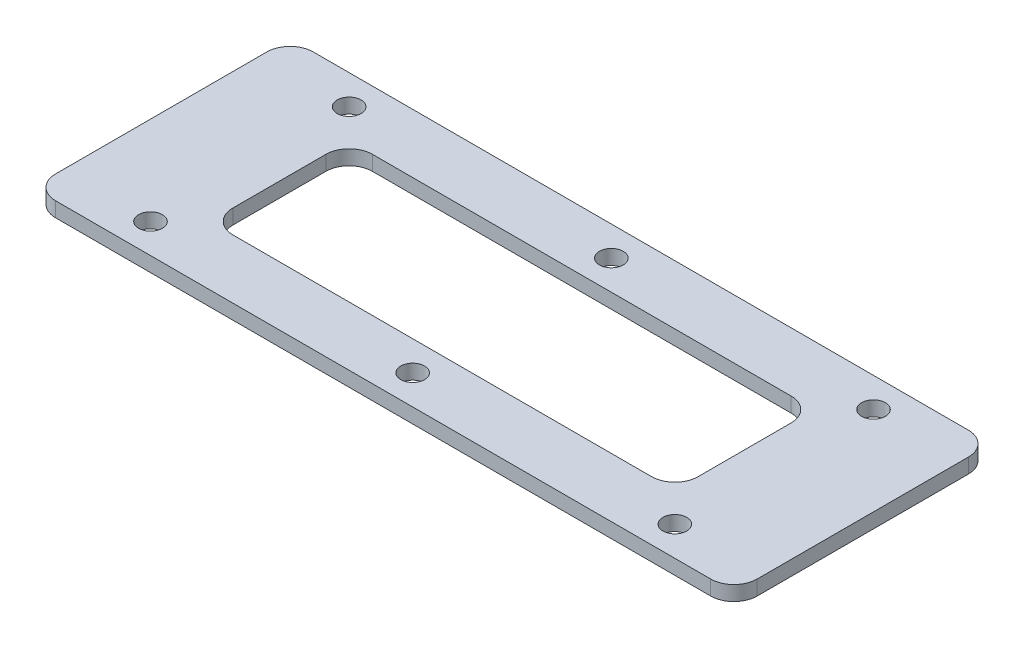
ISO-10303-21;
HEADER;
FILE_DESCRIPTION(('STEP AP214'),'2;1');
FILE_NAME('part.step','',(''),(''),'','','');
FILE_SCHEMA(('AUTOMOTIVE_DESIGN { 1 0 10303 214 1 1 1 1 }'));
ENDSEC;
DATA;
#1=APPLICATION_CONTEXT('core data for automotive mechanical design processes');
#2=APPLICATION_PROTOCOL_DEFINITION('international standard','automotive_design',2000,#1);
#3=PRODUCT_CONTEXT('',#1,'mechanical');
#4=PRODUCT('Part','Part','',(#3));
#5=PRODUCT_RELATED_PRODUCT_CATEGORY('part','',(#4));
#6=PRODUCT_DEFINITION_FORMATION('','',#4);
#7=PRODUCT_DEFINITION_CONTEXT('part definition',#1,'design');
#8=PRODUCT_DEFINITION('design','',#6,#7);
#9=PRODUCT_DEFINITION_SHAPE('','',#8);
#10=(LENGTH_UNIT() NAMED_UNIT(*) SI_UNIT(.MILLI.,.METRE.));
#11=(NAMED_UNIT(*) PLANE_ANGLE_UNIT() SI_UNIT($,.RADIAN.));
#12=(NAMED_UNIT(*) SI_UNIT($,.STERADIAN.) SOLID_ANGLE_UNIT());
#13=UNCERTAINTY_MEASURE_WITH_UNIT(LENGTH_MEASURE(1.E-05),#10,'distance_accuracy_value','');
#14=(GEOMETRIC_REPRESENTATION_CONTEXT(3) GLOBAL_UNCERTAINTY_ASSIGNED_CONTEXT((#13)) GLOBAL_UNIT_ASSIGNED_CONTEXT((#10,
#11,#12)) REPRESENTATION_CONTEXT('',''));
#15=CARTESIAN_POINT('',(0.,0.,0.));
#16=DIRECTION('',(0.,0.,1.));
#17=DIRECTION('',(1.,0.,0.));
#18=AXIS2_PLACEMENT_3D('',#15,#16,#17);
#19=CARTESIAN_POINT('',(-70.4,3.175,-22.7));
#20=DIRECTION('',(0.,1.,0.));
#21=DIRECTION('',(0.,0.,1.));
#22=AXIS2_PLACEMENT_3D('',#19,#20,#21);
#23=PLANE('',#22);
#24=CARTESIAN_POINT('',(0.,3.175,-21.35));
#25=DIRECTION('',(0.,1.,0.));
#26=DIRECTION('',(0.,0.,1.));
#27=AXIS2_PLACEMENT_3D('',#24,#25,#26);
#28=CIRCLE('',#27,2.55269999999999);
#29=CARTESIAN_POINT('',(0.,3.175,-18.7973));
#30=VERTEX_POINT('',#29);
#31=EDGE_CURVE('E404',#30,#30,#28,.T.);
#32=ORIENTED_EDGE('',*,*,#31,.F.);
#33=EDGE_LOOP('',(#32));
#34=FACE_BOUND('',#33,.T.);
#35=CARTESIAN_POINT('',(56.35,3.175,21.35));
#36=DIRECTION('',(0.,1.,0.));
#37=DIRECTION('',(0.,0.,1.));
#38=AXIS2_PLACEMENT_3D('',#35,#36,#37);
#39=CIRCLE('',#38,2.5527);
#40=CARTESIAN_POINT('',(56.35,3.175,23.9027));
#41=VERTEX_POINT('',#40);
#42=EDGE_CURVE('E416',#41,#41,#39,.T.);
#43=ORIENTED_EDGE('',*,*,#42,.F.);
#44=EDGE_LOOP('',(#43));
#45=FACE_BOUND('',#44,.T.);
#46=CARTESIAN_POINT('',(-56.35,3.175,21.35));
#47=DIRECTION('',(0.,1.,0.));
#48=DIRECTION('',(0.,0.,1.));
#49=AXIS2_PLACEMENT_3D('',#46,#47,#48);
#50=CIRCLE('',#49,2.5527);
#51=CARTESIAN_POINT('',(-56.35,3.175,23.9027));
#52=VERTEX_POINT('',#51);
#53=EDGE_CURVE('E192',#52,#52,#50,.T.);
#54=ORIENTED_EDGE('',*,*,#53,.F.);
#55=EDGE_LOOP('',(#54));
#56=FACE_BOUND('',#55,.T.);
#57=CARTESIAN_POINT('',(-70.4,3.175,-22.7));
#58=DIRECTION('',(0.,1.,0.));
#59=DIRECTION('',(0.,0.,1.));
#60=AXIS2_PLACEMENT_3D('',#57,#58,#59);
#61=CIRCLE('',#60,5.);
#62=CARTESIAN_POINT('',(-70.4,3.175,-27.7));
#63=VERTEX_POINT('',#62);
#64=CARTESIAN_POINT('',(-75.4,3.175,-22.7));
#65=VERTEX_POINT('',#64);
#66=EDGE_CURVE('E222',#63,#65,#61,.T.);
#67=ORIENTED_EDGE('',*,*,#66,.T.);
#68=DIRECTION('',(0.,0.,1.));
#69=VECTOR('',#68,1.);
#70=CARTESIAN_POINT('',(-75.4,3.175,-22.7));
#71=LINE('',#70,#69);
#72=CARTESIAN_POINT('',(-75.4,3.175,22.7));
#73=VERTEX_POINT('',#72);
#74=EDGE_CURVE('E225',#65,#73,#71,.T.);
#75=ORIENTED_EDGE('',*,*,#74,.T.);
#76=CARTESIAN_POINT('',(-70.4,3.175,22.7));
#77=DIRECTION('',(0.,1.,0.));
#78=DIRECTION('',(0.,0.,1.));
#79=AXIS2_PLACEMENT_3D('',#76,#77,#78);
#80=CIRCLE('',#79,5.);
#81=CARTESIAN_POINT('',(-70.4,3.175,27.7));
#82=VERTEX_POINT('',#81);
#83=EDGE_CURVE('E228',#73,#82,#80,.T.);
#84=ORIENTED_EDGE('',*,*,#83,.T.);
#85=DIRECTION('',(1.,0.,0.));
#86=VECTOR('',#85,1.);
#87=CARTESIAN_POINT('',(-70.4,3.175,27.7));
#88=LINE('',#87,#86);
#89=CARTESIAN_POINT('',(70.4,3.175,27.7));
#90=VERTEX_POINT('',#89);
#91=EDGE_CURVE('E230',#82,#90,#88,.T.);
#92=ORIENTED_EDGE('',*,*,#91,.T.);
#93=CARTESIAN_POINT('',(70.4,3.175,22.7));
#94=DIRECTION('',(0.,1.,0.));
#95=DIRECTION('',(0.,0.,1.));
#96=AXIS2_PLACEMENT_3D('',#93,#94,#95);
#97=CIRCLE('',#96,5.);
#98=CARTESIAN_POINT('',(75.4,3.175,22.7));
#99=VERTEX_POINT('',#98);
#100=EDGE_CURVE('E232',#90,#99,#97,.T.);
#101=ORIENTED_EDGE('',*,*,#100,.T.);
#102=DIRECTION('',(0.,0.,-1.));
#103=VECTOR('',#102,1.);
#104=CARTESIAN_POINT('',(75.4,3.175,22.7));
#105=LINE('',#104,#103);
#106=CARTESIAN_POINT('',(75.4,3.175,-22.7));
#107=VERTEX_POINT('',#106);
#108=EDGE_CURVE('E234',#99,#107,#105,.T.);
#109=ORIENTED_EDGE('',*,*,#108,.T.);
#110=CARTESIAN_POINT('',(70.4,3.175,-22.7));
#111=DIRECTION('',(0.,1.,0.));
#112=DIRECTION('',(0.,0.,1.));
#113=AXIS2_PLACEMENT_3D('',#110,#111,#112);
#114=CIRCLE('',#113,5.);
#115=CARTESIAN_POINT('',(70.4,3.175,-27.7));
#116=VERTEX_POINT('',#115);
#117=EDGE_CURVE('E236',#107,#116,#114,.T.);
#118=ORIENTED_EDGE('',*,*,#117,.T.);
#119=DIRECTION('',(-1.,0.,0.));
#120=VECTOR('',#119,1.);
#121=CARTESIAN_POINT('',(70.4,3.175,-27.7));
#122=LINE('',#121,#120);
#123=EDGE_CURVE('E238',#116,#63,#122,.T.);
#124=ORIENTED_EDGE('',*,*,#123,.T.);
#125=EDGE_LOOP('',(#67,#75,#84,#92,#101,#109,#118,#124));
#126=FACE_BOUND('',#125,.T.);
#127=DIRECTION('',(0.,0.,1.));
#128=VECTOR('',#127,1.);
#129=CARTESIAN_POINT('',(-50.,3.175,-10.));
#130=LINE('',#129,#128);
#131=CARTESIAN_POINT('',(-50.,3.175,-10.));
#132=VERTEX_POINT('',#131);
#133=CARTESIAN_POINT('',(-50.,3.175,10.));
#134=VERTEX_POINT('',#133);
#135=EDGE_CURVE('E162',#132,#134,#130,.T.);
#136=ORIENTED_EDGE('',*,*,#135,.F.);
#137=CARTESIAN_POINT('',(-45.,3.175,-10.));
#138=DIRECTION('',(0.,1.,0.));
#139=DIRECTION('',(0.,0.,1.));
#140=AXIS2_PLACEMENT_3D('',#137,#138,#139);
#141=CIRCLE('',#140,5.);
#142=CARTESIAN_POINT('',(-45.,3.175,-15.));
#143=VERTEX_POINT('',#142);
#144=EDGE_CURVE('E154',#143,#132,#141,.T.);
#145=ORIENTED_EDGE('',*,*,#144,.F.);
#146=DIRECTION('',(-1.,0.,0.));
#147=VECTOR('',#146,1.);
#148=CARTESIAN_POINT('',(45.,3.175,-15.));
#149=LINE('',#148,#147);
#150=CARTESIAN_POINT('',(45.,3.175,-15.));
#151=VERTEX_POINT('',#150);
#152=EDGE_CURVE('E189',#151,#143,#149,.T.);
#153=ORIENTED_EDGE('',*,*,#152,.F.);
#154=CARTESIAN_POINT('',(45.,3.175,-10.));
#155=DIRECTION('',(0.,1.,0.));
#156=DIRECTION('',(0.,0.,1.));
#157=AXIS2_PLACEMENT_3D('',#154,#155,#156);
#158=CIRCLE('',#157,5.);
#159=CARTESIAN_POINT('',(50.,3.175,-10.));
#160=VERTEX_POINT('',#159);
#161=EDGE_CURVE('E187',#160,#151,#158,.T.);
#162=ORIENTED_EDGE('',*,*,#161,.F.);
#163=DIRECTION('',(0.,0.,-1.));
#164=VECTOR('',#163,1.);
#165=CARTESIAN_POINT('',(50.,3.175,9.99999999999999));
#166=LINE('',#165,#164);
#167=CARTESIAN_POINT('',(50.,3.175,9.99999999999999));
#168=VERTEX_POINT('',#167);
#169=EDGE_CURVE('E185',#168,#160,#166,.T.);
#170=ORIENTED_EDGE('',*,*,#169,.F.);
#171=CARTESIAN_POINT('',(45.,3.175,10.));
#172=DIRECTION('',(0.,1.,0.));
#173=DIRECTION('',(0.,0.,1.));
#174=AXIS2_PLACEMENT_3D('',#171,#172,#173);
#175=CIRCLE('',#174,5.);
#176=CARTESIAN_POINT('',(45.,3.175,15.));
#177=VERTEX_POINT('',#176);
#178=EDGE_CURVE('E183',#177,#168,#175,.T.);
#179=ORIENTED_EDGE('',*,*,#178,.F.);
#180=DIRECTION('',(1.,0.,0.));
#181=VECTOR('',#180,1.);
#182=CARTESIAN_POINT('',(-45.,3.175,15.));
#183=LINE('',#182,#181);
#184=CARTESIAN_POINT('',(-45.,3.175,15.));
#185=VERTEX_POINT('',#184);
#186=EDGE_CURVE('E178',#185,#177,#183,.T.);
#187=ORIENTED_EDGE('',*,*,#186,.F.);
#188=CARTESIAN_POINT('',(-45.,3.175,10.));
#189=DIRECTION('',(0.,1.,0.));
#190=DIRECTION('',(0.,0.,1.));
#191=AXIS2_PLACEMENT_3D('',#188,#189,#190);
#192=CIRCLE('',#191,5.);
#193=EDGE_CURVE('E176',#134,#185,#192,.T.);
#194=ORIENTED_EDGE('',*,*,#193,.F.);
#195=EDGE_LOOP('',(#136,#145,#153,#162,#170,#179,#187,#194));
#196=FACE_BOUND('',#195,.T.);
#197=CARTESIAN_POINT('',(0.,3.175,21.35));
#198=DIRECTION('',(0.,1.,0.));
#199=DIRECTION('',(0.,0.,1.));
#200=AXIS2_PLACEMENT_3D('',#197,#198,#199);
#201=CIRCLE('',#200,2.55269999999999);
#202=CARTESIAN_POINT('',(0.,3.175,23.9027));
#203=VERTEX_POINT('',#202);
#204=EDGE_CURVE('E422',#203,#203,#201,.T.);
#205=ORIENTED_EDGE('',*,*,#204,.F.);
#206=EDGE_LOOP('',(#205));
#207=FACE_BOUND('',#206,.T.);
#208=CARTESIAN_POINT('',(56.35,3.175,-21.35));
#209=DIRECTION('',(0.,1.,0.));
#210=DIRECTION('',(0.,0.,1.));
#211=AXIS2_PLACEMENT_3D('',#208,#209,#210);
#212=CIRCLE('',#211,2.5527);
#213=CARTESIAN_POINT('',(56.35,3.175,-18.7973));
#214=VERTEX_POINT('',#213);
#215=EDGE_CURVE('E410',#214,#214,#212,.T.);
#216=ORIENTED_EDGE('',*,*,#215,.F.);
#217=EDGE_LOOP('',(#216));
#218=FACE_BOUND('',#217,.T.);
#219=CARTESIAN_POINT('',(-56.35,3.175,-21.35));
#220=DIRECTION('',(0.,1.,0.));
#221=DIRECTION('',(0.,0.,1.));
#222=AXIS2_PLACEMENT_3D('',#219,#220,#221);
#223=CIRCLE('',#222,2.5527);
#224=CARTESIAN_POINT('',(-56.35,3.175,-18.7973));
#225=VERTEX_POINT('',#224);
#226=EDGE_CURVE('E395',#225,#225,#223,.T.);
#227=ORIENTED_EDGE('',*,*,#226,.F.);
#228=EDGE_LOOP('',(#227));
#229=FACE_BOUND('',#228,.T.);
#230=ADVANCED_FACE('F41',(#34,#45,#56,#126,#196,#207,#218,#229),#23,.T.);
#231=CARTESIAN_POINT('',(-70.4,0.,-22.7));
#232=DIRECTION('',(0.,1.,0.));
#233=DIRECTION('',(0.,0.,1.));
#234=AXIS2_PLACEMENT_3D('',#231,#232,#233);
#235=PLANE('',#234);
#236=CARTESIAN_POINT('',(-70.4,0.,-22.7));
#237=DIRECTION('',(0.,1.,0.));
#238=DIRECTION('',(0.,0.,1.));
#239=AXIS2_PLACEMENT_3D('',#236,#237,#238);
#240=CIRCLE('',#239,5.);
#241=CARTESIAN_POINT('',(-70.4,0.,-27.7));
#242=VERTEX_POINT('',#241);
#243=CARTESIAN_POINT('',(-75.4,0.,-22.7));
#244=VERTEX_POINT('',#243);
#245=EDGE_CURVE('E170',#242,#244,#240,.T.);
#246=ORIENTED_EDGE('',*,*,#245,.F.);
#247=DIRECTION('',(-1.,0.,0.));
#248=VECTOR('',#247,1.);
#249=CARTESIAN_POINT('',(70.4,0.,-27.7));
#250=LINE('',#249,#248);
#251=CARTESIAN_POINT('',(70.4,0.,-27.7));
#252=VERTEX_POINT('',#251);
#253=EDGE_CURVE('E226',#252,#242,#250,.T.);
#254=ORIENTED_EDGE('',*,*,#253,.F.);
#255=CARTESIAN_POINT('',(70.4,0.,-22.7));
#256=DIRECTION('',(0.,1.,0.));
#257=DIRECTION('',(0.,0.,1.));
#258=AXIS2_PLACEMENT_3D('',#255,#256,#257);
#259=CIRCLE('',#258,5.);
#260=CARTESIAN_POINT('',(75.4,0.,-22.7));
#261=VERTEX_POINT('',#260);
#262=EDGE_CURVE('E254',#261,#252,#259,.T.);
#263=ORIENTED_EDGE('',*,*,#262,.F.);
#264=DIRECTION('',(0.,0.,-1.));
#265=VECTOR('',#264,1.);
#266=CARTESIAN_POINT('',(75.4,0.,0.));
#267=LINE('',#266,#265);
#268=CARTESIAN_POINT('',(75.4,0.,22.7));
#269=VERTEX_POINT('',#268);
#270=EDGE_CURVE('E252',#269,#261,#267,.T.);
#271=ORIENTED_EDGE('',*,*,#270,.F.);
#272=CARTESIAN_POINT('',(70.4,0.,22.7));
#273=DIRECTION('',(0.,1.,0.));
#274=DIRECTION('',(0.,0.,1.));
#275=AXIS2_PLACEMENT_3D('',#272,#273,#274);
#276=CIRCLE('',#275,5.);
#277=CARTESIAN_POINT('',(70.4,0.,27.7));
#278=VERTEX_POINT('',#277);
#279=EDGE_CURVE('E249',#278,#269,#276,.T.);
#280=ORIENTED_EDGE('',*,*,#279,.F.);
#281=DIRECTION('',(1.,0.,0.));
#282=VECTOR('',#281,1.);
#283=CARTESIAN_POINT('',(-70.4,0.,27.7));
#284=LINE('',#283,#282);
#285=CARTESIAN_POINT('',(-70.4,0.,27.7));
#286=VERTEX_POINT('',#285);
#287=EDGE_CURVE('E247',#286,#278,#284,.T.);
#288=ORIENTED_EDGE('',*,*,#287,.F.);
#289=CARTESIAN_POINT('',(-70.4,0.,22.7));
#290=DIRECTION('',(0.,1.,0.));
#291=DIRECTION('',(0.,0.,1.));
#292=AXIS2_PLACEMENT_3D('',#289,#290,#291);
#293=CIRCLE('',#292,5.);
#294=CARTESIAN_POINT('',(-75.4,0.,22.7));
#295=VERTEX_POINT('',#294);
#296=EDGE_CURVE('E245',#295,#286,#293,.T.);
#297=ORIENTED_EDGE('',*,*,#296,.F.);
#298=DIRECTION('',(0.,0.,1.));
#299=VECTOR('',#298,1.);
#300=CARTESIAN_POINT('',(-75.4,0.,0.));
#301=LINE('',#300,#299);
#302=EDGE_CURVE('E243',#244,#295,#301,.T.);
#303=ORIENTED_EDGE('',*,*,#302,.F.);
#304=EDGE_LOOP('',(#246,#254,#263,#271,#280,#288,#297,#303));
#305=FACE_BOUND('',#304,.T.);
#306=CARTESIAN_POINT('',(-45.,0.,-10.));
#307=DIRECTION('',(0.,1.,0.));
#308=DIRECTION('',(0.,0.,1.));
#309=AXIS2_PLACEMENT_3D('',#306,#307,#308);
#310=CIRCLE('',#309,5.);
#311=CARTESIAN_POINT('',(-45.,0.,-15.));
#312=VERTEX_POINT('',#311);
#313=CARTESIAN_POINT('',(-50.,0.,-10.));
#314=VERTEX_POINT('',#313);
#315=EDGE_CURVE('E64',#312,#314,#310,.T.);
#316=ORIENTED_EDGE('',*,*,#315,.T.);
#317=DIRECTION('',(0.,0.,1.));
#318=VECTOR('',#317,1.);
#319=CARTESIAN_POINT('',(-50.,0.,-10.));
#320=LINE('',#319,#318);
#321=CARTESIAN_POINT('',(-50.,0.,10.));
#322=VERTEX_POINT('',#321);
#323=EDGE_CURVE('E169',#314,#322,#320,.T.);
#324=ORIENTED_EDGE('',*,*,#323,.T.);
#325=CARTESIAN_POINT('',(-45.,0.,10.));
#326=DIRECTION('',(0.,1.,0.));
#327=DIRECTION('',(0.,0.,1.));
#328=AXIS2_PLACEMENT_3D('',#325,#326,#327);
#329=CIRCLE('',#328,5.);
#330=CARTESIAN_POINT('',(-45.,0.,15.));
#331=VERTEX_POINT('',#330);
#332=EDGE_CURVE('E194',#322,#331,#329,.T.);
#333=ORIENTED_EDGE('',*,*,#332,.T.);
#334=DIRECTION('',(1.,0.,0.));
#335=VECTOR('',#334,1.);
#336=CARTESIAN_POINT('',(-45.,0.,15.));
#337=LINE('',#336,#335);
#338=CARTESIAN_POINT('',(45.,0.,15.));
#339=VERTEX_POINT('',#338);
#340=EDGE_CURVE('E197',#331,#339,#337,.T.);
#341=ORIENTED_EDGE('',*,*,#340,.T.);
#342=CARTESIAN_POINT('',(45.,0.,10.));
#343=DIRECTION('',(0.,1.,0.));
#344=DIRECTION('',(0.,0.,1.));
#345=AXIS2_PLACEMENT_3D('',#342,#343,#344);
#346=CIRCLE('',#345,5.);
#347=CARTESIAN_POINT('',(50.,0.,9.99999999999999));
#348=VERTEX_POINT('',#347);
#349=EDGE_CURVE('E200',#339,#348,#346,.T.);
#350=ORIENTED_EDGE('',*,*,#349,.T.);
#351=DIRECTION('',(0.,0.,-1.));
#352=VECTOR('',#351,1.);
#353=CARTESIAN_POINT('',(50.,0.,9.99999999999999));
#354=LINE('',#353,#352);
#355=CARTESIAN_POINT('',(50.,0.,-10.));
#356=VERTEX_POINT('',#355);
#357=EDGE_CURVE('E203',#348,#356,#354,.T.);
#358=ORIENTED_EDGE('',*,*,#357,.T.);
#359=CARTESIAN_POINT('',(45.,0.,-10.));
#360=DIRECTION('',(0.,1.,0.));
#361=DIRECTION('',(0.,0.,1.));
#362=AXIS2_PLACEMENT_3D('',#359,#360,#361);
#363=CIRCLE('',#362,5.);
#364=CARTESIAN_POINT('',(45.,0.,-15.));
#365=VERTEX_POINT('',#364);
#366=EDGE_CURVE('E206',#356,#365,#363,.T.);
#367=ORIENTED_EDGE('',*,*,#366,.T.);
#368=DIRECTION('',(-1.,0.,0.));
#369=VECTOR('',#368,1.);
#370=CARTESIAN_POINT('',(45.,0.,-15.));
#371=LINE('',#370,#369);
#372=EDGE_CURVE('E163',#365,#312,#371,.T.);
#373=ORIENTED_EDGE('',*,*,#372,.T.);
#374=EDGE_LOOP('',(#316,#324,#333,#341,#350,#358,#367,#373));
#375=FACE_BOUND('',#374,.T.);
#376=CARTESIAN_POINT('',(-56.35,0.,21.35));
#377=DIRECTION('',(0.,1.,0.));
#378=DIRECTION('',(0.,0.,1.));
#379=AXIS2_PLACEMENT_3D('',#376,#377,#378);
#380=CIRCLE('',#379,2.5527);
#381=CARTESIAN_POINT('',(-56.35,0.,23.9027));
#382=VERTEX_POINT('',#381);
#383=EDGE_CURVE('E425',#382,#382,#380,.T.);
#384=ORIENTED_EDGE('',*,*,#383,.T.);
#385=EDGE_LOOP('',(#384));
#386=FACE_BOUND('',#385,.T.);
#387=CARTESIAN_POINT('',(0.,0.,21.35));
#388=DIRECTION('',(0.,1.,0.));
#389=DIRECTION('',(0.,0.,1.));
#390=AXIS2_PLACEMENT_3D('',#387,#388,#389);
#391=CIRCLE('',#390,2.55269999999999);
#392=CARTESIAN_POINT('',(0.,0.,23.9027));
#393=VERTEX_POINT('',#392);
#394=EDGE_CURVE('E419',#393,#393,#391,.T.);
#395=ORIENTED_EDGE('',*,*,#394,.T.);
#396=EDGE_LOOP('',(#395));
#397=FACE_BOUND('',#396,.T.);
#398=CARTESIAN_POINT('',(56.35,0.,21.35));
#399=DIRECTION('',(0.,1.,0.));
#400=DIRECTION('',(0.,0.,1.));
#401=AXIS2_PLACEMENT_3D('',#398,#399,#400);
#402=CIRCLE('',#401,2.5527);
#403=CARTESIAN_POINT('',(56.35,0.,23.9027));
#404=VERTEX_POINT('',#403);
#405=EDGE_CURVE('E413',#404,#404,#402,.T.);
#406=ORIENTED_EDGE('',*,*,#405,.T.);
#407=EDGE_LOOP('',(#406));
#408=FACE_BOUND('',#407,.T.);
#409=CARTESIAN_POINT('',(56.35,0.,-21.35));
#410=DIRECTION('',(0.,1.,0.));
#411=DIRECTION('',(0.,0.,1.));
#412=AXIS2_PLACEMENT_3D('',#409,#410,#411);
#413=CIRCLE('',#412,2.5527);
#414=CARTESIAN_POINT('',(56.35,0.,-18.7973));
#415=VERTEX_POINT('',#414);
#416=EDGE_CURVE('E407',#415,#415,#413,.T.);
#417=ORIENTED_EDGE('',*,*,#416,.T.);
#418=EDGE_LOOP('',(#417));
#419=FACE_BOUND('',#418,.T.);
#420=CARTESIAN_POINT('',(0.,0.,-21.35));
#421=DIRECTION('',(0.,1.,0.));
#422=DIRECTION('',(0.,0.,1.));
#423=AXIS2_PLACEMENT_3D('',#420,#421,#422);
#424=CIRCLE('',#423,2.55269999999999);
#425=CARTESIAN_POINT('',(0.,0.,-18.7973));
#426=VERTEX_POINT('',#425);
#427=EDGE_CURVE('E401',#426,#426,#424,.T.);
#428=ORIENTED_EDGE('',*,*,#427,.T.);
#429=EDGE_LOOP('',(#428));
#430=FACE_BOUND('',#429,.T.);
#431=CARTESIAN_POINT('',(-56.35,0.,-21.35));
#432=DIRECTION('',(0.,1.,0.));
#433=DIRECTION('',(0.,0.,1.));
#434=AXIS2_PLACEMENT_3D('',#431,#432,#433);
#435=CIRCLE('',#434,2.5527);
#436=CARTESIAN_POINT('',(-56.35,0.,-18.7973));
#437=VERTEX_POINT('',#436);
#438=EDGE_CURVE('E398',#437,#437,#435,.T.);
#439=ORIENTED_EDGE('',*,*,#438,.T.);
#440=EDGE_LOOP('',(#439));
#441=FACE_BOUND('',#440,.T.);
#442=ADVANCED_FACE('F284',(#305,#375,#386,#397,#408,#419,#430,#441),#235,.F.);
#443=CARTESIAN_POINT('',(-70.4,3.175,-22.7));
#444=DIRECTION('',(0.,-1.,0.));
#445=DIRECTION('',(0.,0.,-1.));
#446=AXIS2_PLACEMENT_3D('',#443,#444,#445);
#447=CYLINDRICAL_SURFACE('',#446,5.);
#448=ORIENTED_EDGE('',*,*,#245,.T.);
#449=DIRECTION('',(0.,-1.,0.));
#450=VECTOR('',#449,1.);
#451=CARTESIAN_POINT('',(-75.4,3.175,-22.7));
#452=LINE('',#451,#450);
#453=EDGE_CURVE('E11',#65,#244,#452,.T.);
#454=ORIENTED_EDGE('',*,*,#453,.F.);
#455=ORIENTED_EDGE('',*,*,#66,.F.);
#456=DIRECTION('',(0.,-1.,0.));
#457=VECTOR('',#456,1.);
#458=CARTESIAN_POINT('',(-70.4,3.175,-27.7));
#459=LINE('',#458,#457);
#460=EDGE_CURVE('E240',#63,#242,#459,.T.);
#461=ORIENTED_EDGE('',*,*,#460,.T.);
#462=EDGE_LOOP('',(#448,#454,#455,#461));
#463=FACE_BOUND('',#462,.T.);
#464=ADVANCED_FACE('F43',(#463),#447,.T.);
#465=CARTESIAN_POINT('',(-75.4,3.175,0.));
#466=DIRECTION('',(1.,0.,0.));
#467=DIRECTION('',(0.,0.,-1.));
#468=AXIS2_PLACEMENT_3D('',#465,#466,#467);
#469=PLANE('',#468);
#470=ORIENTED_EDGE('',*,*,#302,.T.);
#471=DIRECTION('',(0.,-1.,0.));
#472=VECTOR('',#471,1.);
#473=CARTESIAN_POINT('',(-75.4,3.175,22.7));
#474=LINE('',#473,#472);
#475=EDGE_CURVE('E49',#73,#295,#474,.T.);
#476=ORIENTED_EDGE('',*,*,#475,.F.);
#477=ORIENTED_EDGE('',*,*,#74,.F.);
#478=ORIENTED_EDGE('',*,*,#453,.T.);
#479=EDGE_LOOP('',(#470,#476,#477,#478));
#480=FACE_BOUND('',#479,.T.);
#481=ADVANCED_FACE('F300',(#480),#469,.F.);
#482=CARTESIAN_POINT('',(-70.4,3.175,22.7));
#483=DIRECTION('',(0.,-1.,0.));
#484=DIRECTION('',(0.,0.,-1.));
#485=AXIS2_PLACEMENT_3D('',#482,#483,#484);
#486=CYLINDRICAL_SURFACE('',#485,5.);
#487=ORIENTED_EDGE('',*,*,#296,.T.);
#488=DIRECTION('',(0.,-1.,0.));
#489=VECTOR('',#488,1.);
#490=CARTESIAN_POINT('',(-70.4,3.175,27.7));
#491=LINE('',#490,#489);
#492=EDGE_CURVE('E271',#82,#286,#491,.T.);
#493=ORIENTED_EDGE('',*,*,#492,.F.);
#494=ORIENTED_EDGE('',*,*,#83,.F.);
#495=ORIENTED_EDGE('',*,*,#475,.T.);
#496=EDGE_LOOP('',(#487,#493,#494,#495));
#497=FACE_BOUND('',#496,.T.);
#498=ADVANCED_FACE('F278',(#497),#486,.T.);
#499=CARTESIAN_POINT('',(-70.4,3.175,27.7));
#500=DIRECTION('',(0.,0.,-1.));
#501=DIRECTION('',(-1.,0.,0.));
#502=AXIS2_PLACEMENT_3D('',#499,#500,#501);
#503=PLANE('',#502);
#504=ORIENTED_EDGE('',*,*,#287,.T.);
#505=DIRECTION('',(0.,-1.,0.));
#506=VECTOR('',#505,1.);
#507=CARTESIAN_POINT('',(70.4,3.175,27.7));
#508=LINE('',#507,#506);
#509=EDGE_CURVE('E268',#90,#278,#508,.T.);
#510=ORIENTED_EDGE('',*,*,#509,.F.);
#511=ORIENTED_EDGE('',*,*,#91,.F.);
#512=ORIENTED_EDGE('',*,*,#492,.T.);
#513=EDGE_LOOP('',(#504,#510,#511,#512));
#514=FACE_BOUND('',#513,.T.);
#515=ADVANCED_FACE('F289',(#514),#503,.F.);
#516=CARTESIAN_POINT('',(70.4,3.175,22.7));
#517=DIRECTION('',(0.,-1.,0.));
#518=DIRECTION('',(0.,0.,-1.));
#519=AXIS2_PLACEMENT_3D('',#516,#517,#518);
#520=CYLINDRICAL_SURFACE('',#519,5.);
#521=ORIENTED_EDGE('',*,*,#279,.T.);
#522=DIRECTION('',(0.,-1.,0.));
#523=VECTOR('',#522,1.);
#524=CARTESIAN_POINT('',(75.4,3.175,22.7));
#525=LINE('',#524,#523);
#526=EDGE_CURVE('E265',#99,#269,#525,.T.);
#527=ORIENTED_EDGE('',*,*,#526,.F.);
#528=ORIENTED_EDGE('',*,*,#100,.F.);
#529=ORIENTED_EDGE('',*,*,#509,.T.);
#530=EDGE_LOOP('',(#521,#527,#528,#529));
#531=FACE_BOUND('',#530,.T.);
#532=ADVANCED_FACE('F293',(#531),#520,.T.);
#533=CARTESIAN_POINT('',(75.4,3.175,0.));
#534=DIRECTION('',(-1.,0.,0.));
#535=DIRECTION('',(0.,0.,1.));
#536=AXIS2_PLACEMENT_3D('',#533,#534,#535);
#537=PLANE('',#536);
#538=ORIENTED_EDGE('',*,*,#270,.T.);
#539=DIRECTION('',(0.,-1.,0.));
#540=VECTOR('',#539,1.);
#541=CARTESIAN_POINT('',(75.4,3.175,-22.7));
#542=LINE('',#541,#540);
#543=EDGE_CURVE('E262',#107,#261,#542,.T.);
#544=ORIENTED_EDGE('',*,*,#543,.F.);
#545=ORIENTED_EDGE('',*,*,#108,.F.);
#546=ORIENTED_EDGE('',*,*,#526,.T.);
#547=EDGE_LOOP('',(#538,#544,#545,#546));
#548=FACE_BOUND('',#547,.T.);
#549=ADVANCED_FACE('F313',(#548),#537,.F.);
#550=CARTESIAN_POINT('',(70.4,3.175,-22.7));
#551=DIRECTION('',(0.,-1.,0.));
#552=DIRECTION('',(0.,0.,-1.));
#553=AXIS2_PLACEMENT_3D('',#550,#551,#552);
#554=CYLINDRICAL_SURFACE('',#553,5.);
#555=ORIENTED_EDGE('',*,*,#262,.T.);
#556=DIRECTION('',(0.,-1.,0.));
#557=VECTOR('',#556,1.);
#558=CARTESIAN_POINT('',(70.4,3.175,-27.7));
#559=LINE('',#558,#557);
#560=EDGE_CURVE('E259',#116,#252,#559,.T.);
#561=ORIENTED_EDGE('',*,*,#560,.F.);
#562=ORIENTED_EDGE('',*,*,#117,.F.);
#563=ORIENTED_EDGE('',*,*,#543,.T.);
#564=EDGE_LOOP('',(#555,#561,#562,#563));
#565=FACE_BOUND('',#564,.T.);
#566=ADVANCED_FACE('F311',(#565),#554,.T.);
#567=CARTESIAN_POINT('',(70.4,3.175,-27.7));
#568=DIRECTION('',(0.,0.,1.));
#569=DIRECTION('',(1.,0.,0.));
#570=AXIS2_PLACEMENT_3D('',#567,#568,#569);
#571=PLANE('',#570);
#572=ORIENTED_EDGE('',*,*,#253,.T.);
#573=ORIENTED_EDGE('',*,*,#460,.F.);
#574=ORIENTED_EDGE('',*,*,#123,.F.);
#575=ORIENTED_EDGE('',*,*,#560,.T.);
#576=EDGE_LOOP('',(#572,#573,#574,#575));
#577=FACE_BOUND('',#576,.T.);
#578=ADVANCED_FACE('F306',(#577),#571,.F.);
#579=CARTESIAN_POINT('',(-45.,3.175,-10.));
#580=DIRECTION('',(0.,-1.,0.));
#581=DIRECTION('',(0.,0.,-1.));
#582=AXIS2_PLACEMENT_3D('',#579,#580,#581);
#583=CYLINDRICAL_SURFACE('',#582,5.);
#584=ORIENTED_EDGE('',*,*,#315,.F.);
#585=DIRECTION('',(0.,-1.,0.));
#586=VECTOR('',#585,1.);
#587=CARTESIAN_POINT('',(-45.,3.175,-15.));
#588=LINE('',#587,#586);
#589=EDGE_CURVE('E158',#143,#312,#588,.T.);
#590=ORIENTED_EDGE('',*,*,#589,.F.);
#591=ORIENTED_EDGE('',*,*,#144,.T.);
#592=DIRECTION('',(0.,-1.,0.));
#593=VECTOR('',#592,1.);
#594=CARTESIAN_POINT('',(-50.,3.175,-10.));
#595=LINE('',#594,#593);
#596=EDGE_CURVE('E157',#132,#314,#595,.T.);
#597=ORIENTED_EDGE('',*,*,#596,.T.);
#598=EDGE_LOOP('',(#584,#590,#591,#597));
#599=FACE_BOUND('',#598,.T.);
#600=ADVANCED_FACE('F156',(#599),#583,.F.);
#601=CARTESIAN_POINT('',(-50.,3.175,-10.));
#602=DIRECTION('',(1.,0.,0.));
#603=DIRECTION('',(0.,0.,-1.));
#604=AXIS2_PLACEMENT_3D('',#601,#602,#603);
#605=PLANE('',#604);
#606=ORIENTED_EDGE('',*,*,#323,.F.);
#607=ORIENTED_EDGE('',*,*,#596,.F.);
#608=ORIENTED_EDGE('',*,*,#135,.T.);
#609=DIRECTION('',(0.,-1.,0.));
#610=VECTOR('',#609,1.);
#611=CARTESIAN_POINT('',(-50.,3.175,10.));
#612=LINE('',#611,#610);
#613=EDGE_CURVE('E171',#134,#322,#612,.T.);
#614=ORIENTED_EDGE('',*,*,#613,.T.);
#615=EDGE_LOOP('',(#606,#607,#608,#614));
#616=FACE_BOUND('',#615,.T.);
#617=ADVANCED_FACE('F166',(#616),#605,.T.);
#618=CARTESIAN_POINT('',(-45.,3.175,10.));
#619=DIRECTION('',(0.,-1.,0.));
#620=DIRECTION('',(0.,0.,-1.));
#621=AXIS2_PLACEMENT_3D('',#618,#619,#620);
#622=CYLINDRICAL_SURFACE('',#621,5.);
#623=ORIENTED_EDGE('',*,*,#332,.F.);
#624=ORIENTED_EDGE('',*,*,#613,.F.);
#625=ORIENTED_EDGE('',*,*,#193,.T.);
#626=DIRECTION('',(0.,-1.,0.));
#627=VECTOR('',#626,1.);
#628=CARTESIAN_POINT('',(-45.,3.175,15.));
#629=LINE('',#628,#627);
#630=EDGE_CURVE('E219',#185,#331,#629,.T.);
#631=ORIENTED_EDGE('',*,*,#630,.T.);
#632=EDGE_LOOP('',(#623,#624,#625,#631));
#633=FACE_BOUND('',#632,.T.);
#634=ADVANCED_FACE('F341',(#633),#622,.F.);
#635=CARTESIAN_POINT('',(-45.,3.175,15.));
#636=DIRECTION('',(0.,0.,-1.));
#637=DIRECTION('',(-1.,0.,0.));
#638=AXIS2_PLACEMENT_3D('',#635,#636,#637);
#639=PLANE('',#638);
#640=ORIENTED_EDGE('',*,*,#340,.F.);
#641=ORIENTED_EDGE('',*,*,#630,.F.);
#642=ORIENTED_EDGE('',*,*,#186,.T.);
#643=DIRECTION('',(0.,-1.,0.));
#644=VECTOR('',#643,1.);
#645=CARTESIAN_POINT('',(45.,3.175,15.));
#646=LINE('',#645,#644);
#647=EDGE_CURVE('E217',#177,#339,#646,.T.);
#648=ORIENTED_EDGE('',*,*,#647,.T.);
#649=EDGE_LOOP('',(#640,#641,#642,#648));
#650=FACE_BOUND('',#649,.T.);
#651=ADVANCED_FACE('F345',(#650),#639,.T.);
#652=CARTESIAN_POINT('',(45.,3.175,10.));
#653=DIRECTION('',(0.,-1.,0.));
#654=DIRECTION('',(0.,0.,-1.));
#655=AXIS2_PLACEMENT_3D('',#652,#653,#654);
#656=CYLINDRICAL_SURFACE('',#655,5.);
#657=ORIENTED_EDGE('',*,*,#349,.F.);
#658=ORIENTED_EDGE('',*,*,#647,.F.);
#659=ORIENTED_EDGE('',*,*,#178,.T.);
#660=DIRECTION('',(0.,-1.,0.));
#661=VECTOR('',#660,1.);
#662=CARTESIAN_POINT('',(50.,3.175,9.99999999999999));
#663=LINE('',#662,#661);
#664=EDGE_CURVE('E215',#168,#348,#663,.T.);
#665=ORIENTED_EDGE('',*,*,#664,.T.);
#666=EDGE_LOOP('',(#657,#658,#659,#665));
#667=FACE_BOUND('',#666,.T.);
#668=ADVANCED_FACE('F351',(#667),#656,.F.);
#669=CARTESIAN_POINT('',(50.,3.175,9.99999999999999));
#670=DIRECTION('',(-1.,0.,0.));
#671=DIRECTION('',(0.,0.,1.));
#672=AXIS2_PLACEMENT_3D('',#669,#670,#671);
#673=PLANE('',#672);
#674=ORIENTED_EDGE('',*,*,#357,.F.);
#675=ORIENTED_EDGE('',*,*,#664,.F.);
#676=ORIENTED_EDGE('',*,*,#169,.T.);
#677=DIRECTION('',(0.,-1.,0.));
#678=VECTOR('',#677,1.);
#679=CARTESIAN_POINT('',(50.,3.175,-10.));
#680=LINE('',#679,#678);
#681=EDGE_CURVE('E213',#160,#356,#680,.T.);
#682=ORIENTED_EDGE('',*,*,#681,.T.);
#683=EDGE_LOOP('',(#674,#675,#676,#682));
#684=FACE_BOUND('',#683,.T.);
#685=ADVANCED_FACE('F355',(#684),#673,.T.);
#686=CARTESIAN_POINT('',(45.,3.175,-10.));
#687=DIRECTION('',(0.,-1.,0.));
#688=DIRECTION('',(0.,0.,-1.));
#689=AXIS2_PLACEMENT_3D('',#686,#687,#688);
#690=CYLINDRICAL_SURFACE('',#689,5.);
#691=ORIENTED_EDGE('',*,*,#366,.F.);
#692=ORIENTED_EDGE('',*,*,#681,.F.);
#693=ORIENTED_EDGE('',*,*,#161,.T.);
#694=DIRECTION('',(0.,-1.,0.));
#695=VECTOR('',#694,1.);
#696=CARTESIAN_POINT('',(45.,3.175,-15.));
#697=LINE('',#696,#695);
#698=EDGE_CURVE('E56',#151,#365,#697,.T.);
#699=ORIENTED_EDGE('',*,*,#698,.T.);
#700=EDGE_LOOP('',(#691,#692,#693,#699));
#701=FACE_BOUND('',#700,.T.);
#702=ADVANCED_FACE('F359',(#701),#690,.F.);
#703=CARTESIAN_POINT('',(45.,3.175,-15.));
#704=DIRECTION('',(0.,0.,1.));
#705=DIRECTION('',(1.,0.,0.));
#706=AXIS2_PLACEMENT_3D('',#703,#704,#705);
#707=PLANE('',#706);
#708=ORIENTED_EDGE('',*,*,#372,.F.);
#709=ORIENTED_EDGE('',*,*,#698,.F.);
#710=ORIENTED_EDGE('',*,*,#152,.T.);
#711=ORIENTED_EDGE('',*,*,#589,.T.);
#712=EDGE_LOOP('',(#708,#709,#710,#711));
#713=FACE_BOUND('',#712,.T.);
#714=ADVANCED_FACE('F363',(#713),#707,.T.);
#715=CARTESIAN_POINT('',(-56.35,3.175,21.35));
#716=DIRECTION('',(0.,-1.,0.));
#717=DIRECTION('',(0.,0.,-1.));
#718=AXIS2_PLACEMENT_3D('',#715,#716,#717);
#719=CYLINDRICAL_SURFACE('',#718,2.5527);
#720=ORIENTED_EDGE('',*,*,#53,.T.);
#721=EDGE_LOOP('',(#720));
#722=FACE_BOUND('',#721,.T.);
#723=ORIENTED_EDGE('',*,*,#383,.F.);
#724=EDGE_LOOP('',(#723));
#725=FACE_BOUND('',#724,.T.);
#726=ADVANCED_FACE('F367',(#722,#725),#719,.F.);
#727=CARTESIAN_POINT('',(0.,3.175,21.35));
#728=DIRECTION('',(0.,-1.,0.));
#729=DIRECTION('',(0.,0.,-1.));
#730=AXIS2_PLACEMENT_3D('',#727,#728,#729);
#731=CYLINDRICAL_SURFACE('',#730,2.55269999999999);
#732=ORIENTED_EDGE('',*,*,#204,.T.);
#733=EDGE_LOOP('',(#732));
#734=FACE_BOUND('',#733,.T.);
#735=ORIENTED_EDGE('',*,*,#394,.F.);
#736=EDGE_LOOP('',(#735));
#737=FACE_BOUND('',#736,.T.);
#738=ADVANCED_FACE('F370',(#734,#737),#731,.F.);
#739=CARTESIAN_POINT('',(56.35,3.175,21.35));
#740=DIRECTION('',(0.,-1.,0.));
#741=DIRECTION('',(0.,0.,-1.));
#742=AXIS2_PLACEMENT_3D('',#739,#740,#741);
#743=CYLINDRICAL_SURFACE('',#742,2.5527);
#744=ORIENTED_EDGE('',*,*,#42,.T.);
#745=EDGE_LOOP('',(#744));
#746=FACE_BOUND('',#745,.T.);
#747=ORIENTED_EDGE('',*,*,#405,.F.);
#748=EDGE_LOOP('',(#747));
#749=FACE_BOUND('',#748,.T.);
#750=ADVANCED_FACE('F374',(#746,#749),#743,.F.);
#751=CARTESIAN_POINT('',(56.35,3.175,-21.35));
#752=DIRECTION('',(0.,-1.,0.));
#753=DIRECTION('',(0.,0.,-1.));
#754=AXIS2_PLACEMENT_3D('',#751,#752,#753);
#755=CYLINDRICAL_SURFACE('',#754,2.5527);
#756=ORIENTED_EDGE('',*,*,#215,.T.);
#757=EDGE_LOOP('',(#756));
#758=FACE_BOUND('',#757,.T.);
#759=ORIENTED_EDGE('',*,*,#416,.F.);
#760=EDGE_LOOP('',(#759));
#761=FACE_BOUND('',#760,.T.);
#762=ADVANCED_FACE('F378',(#758,#761),#755,.F.);
#763=CARTESIAN_POINT('',(0.,3.175,-21.35));
#764=DIRECTION('',(0.,-1.,0.));
#765=DIRECTION('',(0.,0.,-1.));
#766=AXIS2_PLACEMENT_3D('',#763,#764,#765);
#767=CYLINDRICAL_SURFACE('',#766,2.55269999999999);
#768=ORIENTED_EDGE('',*,*,#31,.T.);
#769=EDGE_LOOP('',(#768));
#770=FACE_BOUND('',#769,.T.);
#771=ORIENTED_EDGE('',*,*,#427,.F.);
#772=EDGE_LOOP('',(#771));
#773=FACE_BOUND('',#772,.T.);
#774=ADVANCED_FACE('F382',(#770,#773),#767,.F.);
#775=CARTESIAN_POINT('',(-56.35,3.175,-21.35));
#776=DIRECTION('',(0.,-1.,0.));
#777=DIRECTION('',(0.,0.,-1.));
#778=AXIS2_PLACEMENT_3D('',#775,#776,#777);
#779=CYLINDRICAL_SURFACE('',#778,2.5527);
#780=ORIENTED_EDGE('',*,*,#226,.T.);
#781=EDGE_LOOP('',(#780));
#782=FACE_BOUND('',#781,.T.);
#783=ORIENTED_EDGE('',*,*,#438,.F.);
#784=EDGE_LOOP('',(#783));
#785=FACE_BOUND('',#784,.T.);
#786=ADVANCED_FACE('F386',(#782,#785),#779,.F.);
#787=CLOSED_SHELL('',(#230,#442,#464,#481,#498,#515,#532,#549,#566,#578,#600,#617,#634,#651,
#668,#685,#702,#714,#726,#738,#750,#762,#774,#786));
#788=MANIFOLD_SOLID_BREP('B2',#787);
#789=ADVANCED_BREP_SHAPE_REPRESENTATION('',(#18,#788),#14);
#790=SHAPE_DEFINITION_REPRESENTATION(#9,#789);
ENDSEC;
END-ISO-10303-21;
